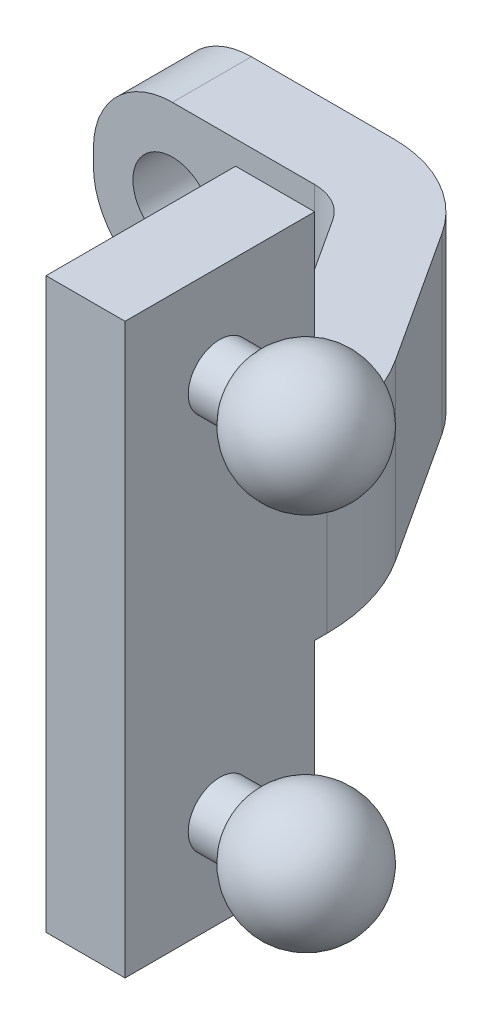
ISO-10303-21;
HEADER;
FILE_DESCRIPTION(('STEP AP214'),'2;1');
FILE_NAME('part.step','',(''),(''),'','','');
FILE_SCHEMA(('AUTOMOTIVE_DESIGN { 1 0 10303 214 1 1 1 1 }'));
ENDSEC;
DATA;
#1=APPLICATION_CONTEXT('core data for automotive mechanical design processes');
#2=APPLICATION_PROTOCOL_DEFINITION('international standard','automotive_design',2000,#1);
#3=PRODUCT_CONTEXT('',#1,'mechanical');
#4=PRODUCT('Part','Part','',(#3));
#5=PRODUCT_RELATED_PRODUCT_CATEGORY('part','',(#4));
#6=PRODUCT_DEFINITION_FORMATION('','',#4);
#7=PRODUCT_DEFINITION_CONTEXT('part definition',#1,'design');
#8=PRODUCT_DEFINITION('design','',#6,#7);
#9=PRODUCT_DEFINITION_SHAPE('','',#8);
#10=(LENGTH_UNIT() NAMED_UNIT(*) SI_UNIT(.MILLI.,.METRE.));
#11=(NAMED_UNIT(*) PLANE_ANGLE_UNIT() SI_UNIT($,.RADIAN.));
#12=(NAMED_UNIT(*) SI_UNIT($,.STERADIAN.) SOLID_ANGLE_UNIT());
#13=UNCERTAINTY_MEASURE_WITH_UNIT(LENGTH_MEASURE(1.E-05),#10,'distance_accuracy_value','');
#14=(GEOMETRIC_REPRESENTATION_CONTEXT(3) GLOBAL_UNCERTAINTY_ASSIGNED_CONTEXT((#13)) GLOBAL_UNIT_ASSIGNED_CONTEXT((#10,
#11,#12)) REPRESENTATION_CONTEXT('',''));
#15=CARTESIAN_POINT('',(0.,0.,0.));
#16=DIRECTION('',(0.,0.,1.));
#17=DIRECTION('',(1.,0.,0.));
#18=AXIS2_PLACEMENT_3D('',#15,#16,#17);
#19=CARTESIAN_POINT('',(0.,2.75,0.));
#20=DIRECTION('',(1.,0.,0.));
#21=DIRECTION('',(0.,0.,-1.));
#22=AXIS2_PLACEMENT_3D('',#19,#20,#21);
#23=PLANE('',#22);
#24=DIRECTION('',(0.,-1.,0.));
#25=VECTOR('',#24,1.);
#26=CARTESIAN_POINT('',(0.,2.75,0.));
#27=LINE('',#26,#25);
#28=CARTESIAN_POINT('',(0.,0.25,0.));
#29=VERTEX_POINT('',#28);
#30=CARTESIAN_POINT('',(0.,-0.25,0.));
#31=VERTEX_POINT('',#30);
#32=EDGE_CURVE('E245',#29,#31,#27,.T.);
#33=ORIENTED_EDGE('',*,*,#32,.T.);
#34=DIRECTION('',(0.,0.,1.));
#35=VECTOR('',#34,1.);
#36=CARTESIAN_POINT('',(0.,-0.25,2.5));
#37=LINE('',#36,#35);
#38=CARTESIAN_POINT('',(0.,-0.25,2.5));
#39=VERTEX_POINT('',#38);
#40=EDGE_CURVE('E296',#31,#39,#37,.T.);
#41=ORIENTED_EDGE('',*,*,#40,.T.);
#42=DIRECTION('',(0.,-1.,0.));
#43=VECTOR('',#42,1.);
#44=CARTESIAN_POINT('',(0.,2.75,2.5));
#45=LINE('',#44,#43);
#46=CARTESIAN_POINT('',(0.,0.25,2.5));
#47=VERTEX_POINT('',#46);
#48=EDGE_CURVE('E291',#47,#39,#45,.T.);
#49=ORIENTED_EDGE('',*,*,#48,.F.);
#50=DIRECTION('',(0.,0.,1.));
#51=VECTOR('',#50,1.);
#52=CARTESIAN_POINT('',(0.,0.25,0.));
#53=LINE('',#52,#51);
#54=EDGE_CURVE('E294',#47,#29,#53,.F.);
#55=ORIENTED_EDGE('',*,*,#54,.T.);
#56=EDGE_LOOP('',(#33,#41,#49,#55));
#57=FACE_BOUND('',#56,.T.);
#58=ADVANCED_FACE('F41',(#57),#23,.F.);
#59=CARTESIAN_POINT('',(0.,2.75,2.5));
#60=DIRECTION('',(0.,0.,-1.));
#61=DIRECTION('',(-1.,0.,0.));
#62=AXIS2_PLACEMENT_3D('',#59,#60,#61);
#63=PLANE('',#62);
#64=CARTESIAN_POINT('',(2.5,0.,2.5));
#65=DIRECTION('',(0.,0.,-1.));
#66=DIRECTION('',(-1.,0.,0.));
#67=AXIS2_PLACEMENT_3D('',#64,#65,#66);
#68=CIRCLE('',#67,1.25);
#69=CARTESIAN_POINT('',(1.25,0.,2.5));
#70=VERTEX_POINT('',#69);
#71=EDGE_CURVE('E220',#70,#70,#68,.T.);
#72=ORIENTED_EDGE('',*,*,#71,.T.);
#73=EDGE_LOOP('',(#72));
#74=FACE_BOUND('',#73,.T.);
#75=ORIENTED_EDGE('',*,*,#48,.T.);
#76=CARTESIAN_POINT('',(2.5,-0.25,2.5));
#77=DIRECTION('',(0.,0.,-1.));
#78=DIRECTION('',(-1.,0.,0.));
#79=AXIS2_PLACEMENT_3D('',#76,#77,#78);
#80=CIRCLE('',#79,2.5);
#81=CARTESIAN_POINT('',(2.5,-2.75,2.5));
#82=VERTEX_POINT('',#81);
#83=EDGE_CURVE('E301',#39,#82,#80,.F.);
#84=ORIENTED_EDGE('',*,*,#83,.T.);
#85=DIRECTION('',(1.,0.,0.));
#86=VECTOR('',#85,1.);
#87=CARTESIAN_POINT('',(0.,-2.75,2.5));
#88=LINE('',#87,#86);
#89=CARTESIAN_POINT('',(7.,-2.75,2.5));
#90=VERTEX_POINT('',#89);
#91=EDGE_CURVE('E223',#82,#90,#88,.T.);
#92=ORIENTED_EDGE('',*,*,#91,.T.);
#93=DIRECTION('',(0.,-1.,0.));
#94=VECTOR('',#93,1.);
#95=CARTESIAN_POINT('',(7.,2.75,2.5));
#96=LINE('',#95,#94);
#97=CARTESIAN_POINT('',(7.,2.75,2.5));
#98=VERTEX_POINT('',#97);
#99=EDGE_CURVE('E288',#98,#90,#96,.T.);
#100=ORIENTED_EDGE('',*,*,#99,.F.);
#101=DIRECTION('',(1.,0.,0.));
#102=VECTOR('',#101,1.);
#103=CARTESIAN_POINT('',(0.,2.75,2.5));
#104=LINE('',#103,#102);
#105=CARTESIAN_POINT('',(2.5,2.75,2.5));
#106=VERTEX_POINT('',#105);
#107=EDGE_CURVE('E224',#106,#98,#104,.T.);
#108=ORIENTED_EDGE('',*,*,#107,.F.);
#109=CARTESIAN_POINT('',(2.5,0.25,2.5));
#110=DIRECTION('',(0.,0.,-1.));
#111=DIRECTION('',(-1.,0.,0.));
#112=AXIS2_PLACEMENT_3D('',#109,#110,#111);
#113=CIRCLE('',#112,2.5);
#114=EDGE_CURVE('E299',#106,#47,#113,.F.);
#115=ORIENTED_EDGE('',*,*,#114,.T.);
#116=EDGE_LOOP('',(#75,#84,#92,#100,#108,#115));
#117=FACE_BOUND('',#116,.T.);
#118=ADVANCED_FACE('F384',(#74,#117),#63,.F.);
#119=CARTESIAN_POINT('',(7.,2.75,4.));
#120=DIRECTION('',(0.,-1.,0.));
#121=DIRECTION('',(0.,0.,-1.));
#122=AXIS2_PLACEMENT_3D('',#119,#120,#121);
#123=CYLINDRICAL_SURFACE('',#122,1.5);
#124=CARTESIAN_POINT('',(7.,-2.75,4.));
#125=DIRECTION('',(0.,-1.,0.));
#126=DIRECTION('',(0.,0.,-1.));
#127=AXIS2_PLACEMENT_3D('',#124,#125,#126);
#128=CIRCLE('',#127,1.5);
#129=CARTESIAN_POINT('',(8.25754577081105,-2.75,3.18233342106012));
#130=VERTEX_POINT('',#129);
#131=EDGE_CURVE('E247',#90,#130,#128,.T.);
#132=ORIENTED_EDGE('',*,*,#131,.T.);
#133=DIRECTION('',(0.,-1.,0.));
#134=VECTOR('',#133,1.);
#135=CARTESIAN_POINT('',(8.25754577081105,2.75,3.18233342106012));
#136=LINE('',#135,#134);
#137=CARTESIAN_POINT('',(8.25754577081105,2.75,3.18233342106012));
#138=VERTEX_POINT('',#137);
#139=EDGE_CURVE('E285',#138,#130,#136,.T.);
#140=ORIENTED_EDGE('',*,*,#139,.F.);
#141=CARTESIAN_POINT('',(7.,2.75,4.));
#142=DIRECTION('',(0.,-1.,0.));
#143=DIRECTION('',(0.,0.,-1.));
#144=AXIS2_PLACEMENT_3D('',#141,#142,#143);
#145=CIRCLE('',#144,1.5);
#146=EDGE_CURVE('E226',#98,#138,#145,.T.);
#147=ORIENTED_EDGE('',*,*,#146,.F.);
#148=ORIENTED_EDGE('',*,*,#99,.T.);
#149=EDGE_LOOP('',(#132,#140,#147,#148));
#150=FACE_BOUND('',#149,.T.);
#151=ADVANCED_FACE('F347',(#150),#123,.F.);
#152=CARTESIAN_POINT('',(8.25754577081105,2.75,3.18233342106012));
#153=DIRECTION('',(0.838363847207363,0.,-0.54511105262659));
#154=DIRECTION('',(-0.54511105262659,0.,-0.838363847207363));
#155=AXIS2_PLACEMENT_3D('',#152,#153,#154);
#156=PLANE('',#155);
#157=DIRECTION('',(0.54511105262659,0.,0.838363847207363));
#158=VECTOR('',#157,1.);
#159=CARTESIAN_POINT('',(8.25754577081105,-2.75,3.18233342106012));
#160=LINE('',#159,#158);
#161=CARTESIAN_POINT('',(10.9902966016318,-2.75,7.38521921643481));
#162=VERTEX_POINT('',#161);
#163=EDGE_CURVE('E249',#130,#162,#160,.T.);
#164=ORIENTED_EDGE('',*,*,#163,.T.);
#165=DIRECTION('',(0.,-1.,0.));
#166=VECTOR('',#165,1.);
#167=CARTESIAN_POINT('',(10.9902966016318,2.75,7.38521921643481));
#168=LINE('',#167,#166);
#169=CARTESIAN_POINT('',(10.9902966016318,2.75,7.38521921643481));
#170=VERTEX_POINT('',#169);
#171=EDGE_CURVE('E282',#170,#162,#168,.T.);
#172=ORIENTED_EDGE('',*,*,#171,.F.);
#173=DIRECTION('',(0.54511105262659,0.,0.838363847207363));
#174=VECTOR('',#173,1.);
#175=CARTESIAN_POINT('',(8.25754577081105,2.75,3.18233342106012));
#176=LINE('',#175,#174);
#177=EDGE_CURVE('E229',#138,#170,#176,.T.);
#178=ORIENTED_EDGE('',*,*,#177,.F.);
#179=ORIENTED_EDGE('',*,*,#139,.T.);
#180=EDGE_LOOP('',(#164,#172,#178,#179));
#181=FACE_BOUND('',#180,.T.);
#182=ADVANCED_FACE('F343',(#181),#156,.F.);
#183=CARTESIAN_POINT('',(8.34660028365028,2.75,9.10417225516659));
#184=DIRECTION('',(0.,-1.,0.));
#185=DIRECTION('',(0.,0.,-1.));
#186=AXIS2_PLACEMENT_3D('',#183,#184,#185);
#187=CYLINDRICAL_SURFACE('',#186,3.15339971634972);
#188=CARTESIAN_POINT('',(8.34660028365028,-2.75,9.10417225516659));
#189=DIRECTION('',(0.,-1.,0.));
#190=DIRECTION('',(0.,0.,1.));
#191=AXIS2_PLACEMENT_3D('',#188,#189,#190);
#192=CIRCLE('',#191,3.15339971634972);
#193=CARTESIAN_POINT('',(11.5,-2.75,9.10417225516659));
#194=VERTEX_POINT('',#193);
#195=EDGE_CURVE('E251',#162,#194,#192,.T.);
#196=ORIENTED_EDGE('',*,*,#195,.T.);
#197=DIRECTION('',(0.,-1.,0.));
#198=VECTOR('',#197,1.);
#199=CARTESIAN_POINT('',(11.5,2.75,9.10417225516659));
#200=LINE('',#199,#198);
#201=CARTESIAN_POINT('',(11.5,2.75,9.10417225516659));
#202=VERTEX_POINT('',#201);
#203=EDGE_CURVE('E179',#202,#194,#200,.T.);
#204=ORIENTED_EDGE('',*,*,#203,.F.);
#205=CARTESIAN_POINT('',(8.34660028365028,2.75,9.10417225516659));
#206=DIRECTION('',(0.,-1.,0.));
#207=DIRECTION('',(0.,0.,1.));
#208=AXIS2_PLACEMENT_3D('',#205,#206,#207);
#209=CIRCLE('',#208,3.15339971634972);
#210=EDGE_CURVE('E231',#170,#202,#209,.T.);
#211=ORIENTED_EDGE('',*,*,#210,.F.);
#212=ORIENTED_EDGE('',*,*,#171,.T.);
#213=EDGE_LOOP('',(#196,#204,#211,#212));
#214=FACE_BOUND('',#213,.T.);
#215=ADVANCED_FACE('F339',(#214),#187,.F.);
#216=CARTESIAN_POINT('',(11.5,2.75,9.10417225516659));
#217=DIRECTION('',(1.,0.,0.));
#218=DIRECTION('',(0.,0.,-1.));
#219=AXIS2_PLACEMENT_3D('',#216,#217,#218);
#220=PLANE('',#219);
#221=DIRECTION('',(0.,0.,1.));
#222=VECTOR('',#221,1.);
#223=CARTESIAN_POINT('',(11.5,-2.75,9.10417225516659));
#224=LINE('',#223,#222);
#225=CARTESIAN_POINT('',(11.5,-2.75,9.5));
#226=VERTEX_POINT('',#225);
#227=EDGE_CURVE('E253',#194,#226,#224,.T.);
#228=ORIENTED_EDGE('',*,*,#227,.T.);
#229=DIRECTION('',(0.,-1.,0.));
#230=VECTOR('',#229,1.);
#231=CARTESIAN_POINT('',(11.5,8.99999999999999,9.5));
#232=LINE('',#231,#230);
#233=CARTESIAN_POINT('',(11.5,-9.,9.5));
#234=VERTEX_POINT('',#233);
#235=EDGE_CURVE('E193',#226,#234,#232,.T.);
#236=ORIENTED_EDGE('',*,*,#235,.T.);
#237=DIRECTION('',(0.,0.,1.));
#238=VECTOR('',#237,1.);
#239=CARTESIAN_POINT('',(11.5,-9.,9.5));
#240=LINE('',#239,#238);
#241=CARTESIAN_POINT('',(11.5,-9.,15.5));
#242=VERTEX_POINT('',#241);
#243=EDGE_CURVE('E175',#234,#242,#240,.T.);
#244=ORIENTED_EDGE('',*,*,#243,.T.);
#245=DIRECTION('',(0.,-1.,0.));
#246=VECTOR('',#245,1.);
#247=CARTESIAN_POINT('',(11.5,2.75,15.5));
#248=LINE('',#247,#246);
#249=CARTESIAN_POINT('',(11.5,9.,15.5));
#250=VERTEX_POINT('',#249);
#251=EDGE_CURVE('E167',#250,#242,#248,.T.);
#252=ORIENTED_EDGE('',*,*,#251,.F.);
#253=DIRECTION('',(0.,0.,-1.));
#254=VECTOR('',#253,1.);
#255=CARTESIAN_POINT('',(11.5,8.99999999999999,9.5));
#256=LINE('',#255,#254);
#257=CARTESIAN_POINT('',(11.5,8.99999999999999,9.5));
#258=VERTEX_POINT('',#257);
#259=EDGE_CURVE('E173',#250,#258,#256,.T.);
#260=ORIENTED_EDGE('',*,*,#259,.T.);
#261=CARTESIAN_POINT('',(11.5,2.75,9.5));
#262=VERTEX_POINT('',#261);
#263=EDGE_CURVE('E196',#258,#262,#232,.T.);
#264=ORIENTED_EDGE('',*,*,#263,.T.);
#265=DIRECTION('',(0.,0.,1.));
#266=VECTOR('',#265,1.);
#267=CARTESIAN_POINT('',(11.5,2.75,9.10417225516659));
#268=LINE('',#267,#266);
#269=EDGE_CURVE('E56',#202,#262,#268,.T.);
#270=ORIENTED_EDGE('',*,*,#269,.F.);
#271=ORIENTED_EDGE('',*,*,#203,.T.);
#272=EDGE_LOOP('',(#228,#236,#244,#252,#260,#264,#270,#271));
#273=FACE_BOUND('',#272,.T.);
#274=ADVANCED_FACE('F170',(#273),#220,.F.);
#275=CARTESIAN_POINT('',(11.5,2.75,15.5));
#276=DIRECTION('',(0.,0.,-1.));
#277=DIRECTION('',(-1.,0.,0.));
#278=AXIS2_PLACEMENT_3D('',#275,#276,#277);
#279=PLANE('',#278);
#280=ORIENTED_EDGE('',*,*,#251,.T.);
#281=DIRECTION('',(-1.,0.,0.));
#282=VECTOR('',#281,1.);
#283=CARTESIAN_POINT('',(32.9736659610103,-9.,15.5));
#284=LINE('',#283,#282);
#285=CARTESIAN_POINT('',(14.,-9.,15.5));
#286=VERTEX_POINT('',#285);
#287=EDGE_CURVE('E206',#286,#242,#284,.T.);
#288=ORIENTED_EDGE('',*,*,#287,.F.);
#289=DIRECTION('',(0.,-1.,0.));
#290=VECTOR('',#289,1.);
#291=CARTESIAN_POINT('',(14.,2.75,15.5));
#292=LINE('',#291,#290);
#293=CARTESIAN_POINT('',(14.,9.,15.5));
#294=VERTEX_POINT('',#293);
#295=EDGE_CURVE('E180',#294,#286,#292,.T.);
#296=ORIENTED_EDGE('',*,*,#295,.F.);
#297=DIRECTION('',(-1.,0.,0.));
#298=VECTOR('',#297,1.);
#299=CARTESIAN_POINT('',(32.9736659610103,9.,15.5));
#300=LINE('',#299,#298);
#301=EDGE_CURVE('E183',#294,#250,#300,.T.);
#302=ORIENTED_EDGE('',*,*,#301,.T.);
#303=EDGE_LOOP('',(#280,#288,#296,#302));
#304=FACE_BOUND('',#303,.T.);
#305=ADVANCED_FACE('F184',(#304),#279,.F.);
#306=CARTESIAN_POINT('',(14.,2.75,9.10417225516659));
#307=DIRECTION('',(-1.,0.,0.));
#308=DIRECTION('',(0.,0.,1.));
#309=AXIS2_PLACEMENT_3D('',#306,#307,#308);
#310=PLANE('',#309);
#311=CARTESIAN_POINT('',(14.,-5.99999999999999,12.5));
#312=DIRECTION('',(-1.,0.,0.));
#313=DIRECTION('',(0.,0.,-1.));
#314=AXIS2_PLACEMENT_3D('',#311,#312,#313);
#315=CIRCLE('',#314,1.);
#316=CARTESIAN_POINT('',(14.,-5.99999999999999,11.5));
#317=VERTEX_POINT('',#316);
#318=EDGE_CURVE('E199',#317,#317,#315,.T.);
#319=ORIENTED_EDGE('',*,*,#318,.T.);
#320=EDGE_LOOP('',(#319));
#321=FACE_BOUND('',#320,.T.);
#322=CARTESIAN_POINT('',(14.,5.99999999999999,12.5));
#323=DIRECTION('',(-1.,0.,0.));
#324=DIRECTION('',(0.,0.,1.));
#325=AXIS2_PLACEMENT_3D('',#322,#323,#324);
#326=CIRCLE('',#325,1.);
#327=CARTESIAN_POINT('',(14.,5.99999999999999,13.5));
#328=VERTEX_POINT('',#327);
#329=EDGE_CURVE('E11',#328,#328,#326,.F.);
#330=ORIENTED_EDGE('',*,*,#329,.F.);
#331=EDGE_LOOP('',(#330));
#332=FACE_BOUND('',#331,.T.);
#333=DIRECTION('',(0.,0.,-1.));
#334=VECTOR('',#333,1.);
#335=CARTESIAN_POINT('',(14.,2.75,9.10417225516659));
#336=LINE('',#335,#334);
#337=CARTESIAN_POINT('',(14.,2.75,9.5));
#338=VERTEX_POINT('',#337);
#339=CARTESIAN_POINT('',(14.,2.75,9.10417225516659));
#340=VERTEX_POINT('',#339);
#341=EDGE_CURVE('E234',#338,#340,#336,.T.);
#342=ORIENTED_EDGE('',*,*,#341,.F.);
#343=DIRECTION('',(0.,1.,0.));
#344=VECTOR('',#343,1.);
#345=CARTESIAN_POINT('',(14.,8.99999999999999,9.5));
#346=LINE('',#345,#344);
#347=CARTESIAN_POINT('',(14.,8.99999999999999,9.5));
#348=VERTEX_POINT('',#347);
#349=EDGE_CURVE('E208',#338,#348,#346,.T.);
#350=ORIENTED_EDGE('',*,*,#349,.T.);
#351=DIRECTION('',(0.,0.,1.));
#352=VECTOR('',#351,1.);
#353=CARTESIAN_POINT('',(14.,8.99999999999999,9.49999999999999));
#354=LINE('',#353,#352);
#355=EDGE_CURVE('E213',#348,#294,#354,.T.);
#356=ORIENTED_EDGE('',*,*,#355,.T.);
#357=ORIENTED_EDGE('',*,*,#295,.T.);
#358=DIRECTION('',(0.,0.,-1.));
#359=VECTOR('',#358,1.);
#360=CARTESIAN_POINT('',(14.,-9.,9.49999999999999));
#361=LINE('',#360,#359);
#362=CARTESIAN_POINT('',(14.,-9.,9.5));
#363=VERTEX_POINT('',#362);
#364=EDGE_CURVE('E202',#286,#363,#361,.T.);
#365=ORIENTED_EDGE('',*,*,#364,.T.);
#366=CARTESIAN_POINT('',(14.,-2.75,9.49999999999999));
#367=VERTEX_POINT('',#366);
#368=EDGE_CURVE('E64',#363,#367,#346,.T.);
#369=ORIENTED_EDGE('',*,*,#368,.T.);
#370=DIRECTION('',(0.,0.,-1.));
#371=VECTOR('',#370,1.);
#372=CARTESIAN_POINT('',(14.,-2.75,9.10417225516659));
#373=LINE('',#372,#371);
#374=CARTESIAN_POINT('',(14.,-2.75,9.10417225516659));
#375=VERTEX_POINT('',#374);
#376=EDGE_CURVE('E255',#367,#375,#373,.T.);
#377=ORIENTED_EDGE('',*,*,#376,.T.);
#378=DIRECTION('',(0.,-1.,0.));
#379=VECTOR('',#378,1.);
#380=CARTESIAN_POINT('',(14.,2.75,9.10417225516659));
#381=LINE('',#380,#379);
#382=EDGE_CURVE('E276',#340,#375,#381,.T.);
#383=ORIENTED_EDGE('',*,*,#382,.F.);
#384=EDGE_LOOP('',(#342,#350,#356,#357,#365,#369,#377,#383));
#385=FACE_BOUND('',#384,.T.);
#386=ADVANCED_FACE('F322',(#321,#332,#385),#310,.F.);
#387=CARTESIAN_POINT('',(8.34660028365028,2.75,9.10417225516659));
#388=DIRECTION('',(0.,-1.,0.));
#389=DIRECTION('',(0.,0.,-1.));
#390=AXIS2_PLACEMENT_3D('',#387,#388,#389);
#391=CYLINDRICAL_SURFACE('',#390,5.65339971634972);
#392=CARTESIAN_POINT('',(8.34660028365028,-2.75,9.10417225516659));
#393=DIRECTION('',(0.,1.,0.));
#394=DIRECTION('',(0.,0.,-1.));
#395=AXIS2_PLACEMENT_3D('',#392,#393,#394);
#396=CIRCLE('',#395,5.65339971634972);
#397=CARTESIAN_POINT('',(13.0862062196502,-2.75,6.02244158486833));
#398=VERTEX_POINT('',#397);
#399=EDGE_CURVE('E257',#375,#398,#396,.T.);
#400=ORIENTED_EDGE('',*,*,#399,.T.);
#401=DIRECTION('',(0.,-1.,0.));
#402=VECTOR('',#401,1.);
#403=CARTESIAN_POINT('',(13.0862062196502,2.75,6.02244158486833));
#404=LINE('',#403,#402);
#405=CARTESIAN_POINT('',(13.0862062196502,2.75,6.02244158486833));
#406=VERTEX_POINT('',#405);
#407=EDGE_CURVE('E273',#406,#398,#404,.T.);
#408=ORIENTED_EDGE('',*,*,#407,.F.);
#409=CARTESIAN_POINT('',(8.34660028365028,2.75,9.10417225516659));
#410=DIRECTION('',(0.,1.,0.));
#411=DIRECTION('',(0.,0.,-1.));
#412=AXIS2_PLACEMENT_3D('',#409,#410,#411);
#413=CIRCLE('',#412,5.65339971634972);
#414=EDGE_CURVE('E236',#340,#406,#413,.T.);
#415=ORIENTED_EDGE('',*,*,#414,.F.);
#416=ORIENTED_EDGE('',*,*,#382,.T.);
#417=EDGE_LOOP('',(#400,#408,#415,#416));
#418=FACE_BOUND('',#417,.T.);
#419=ADVANCED_FACE('F325',(#418),#391,.T.);
#420=CARTESIAN_POINT('',(10.3534553888295,2.75,1.81955578949364));
#421=DIRECTION('',(-0.838363847207363,0.,0.54511105262659));
#422=DIRECTION('',(0.54511105262659,0.,0.838363847207363));
#423=AXIS2_PLACEMENT_3D('',#420,#421,#422);
#424=PLANE('',#423);
#425=DIRECTION('',(-0.54511105262659,0.,-0.838363847207363));
#426=VECTOR('',#425,1.);
#427=CARTESIAN_POINT('',(10.3534553888295,-2.75,1.81955578949364));
#428=LINE('',#427,#426);
#429=CARTESIAN_POINT('',(10.3534553888295,-2.75,1.81955578949364));
#430=VERTEX_POINT('',#429);
#431=EDGE_CURVE('E259',#398,#430,#428,.T.);
#432=ORIENTED_EDGE('',*,*,#431,.T.);
#433=DIRECTION('',(0.,-1.,0.));
#434=VECTOR('',#433,1.);
#435=CARTESIAN_POINT('',(10.3534553888295,2.75,1.81955578949364));
#436=LINE('',#435,#434);
#437=CARTESIAN_POINT('',(10.3534553888295,2.75,1.81955578949364));
#438=VERTEX_POINT('',#437);
#439=EDGE_CURVE('E270',#438,#430,#436,.T.);
#440=ORIENTED_EDGE('',*,*,#439,.F.);
#441=DIRECTION('',(-0.54511105262659,0.,-0.838363847207363));
#442=VECTOR('',#441,1.);
#443=CARTESIAN_POINT('',(10.3534553888295,2.75,1.81955578949364));
#444=LINE('',#443,#442);
#445=EDGE_CURVE('E238',#406,#438,#444,.T.);
#446=ORIENTED_EDGE('',*,*,#445,.F.);
#447=ORIENTED_EDGE('',*,*,#407,.T.);
#448=EDGE_LOOP('',(#432,#440,#446,#447));
#449=FACE_BOUND('',#448,.T.);
#450=ADVANCED_FACE('F374',(#449),#424,.F.);
#451=CARTESIAN_POINT('',(7.,2.75,4.));
#452=DIRECTION('',(0.,-1.,0.));
#453=DIRECTION('',(0.,0.,-1.));
#454=AXIS2_PLACEMENT_3D('',#451,#452,#453);
#455=CYLINDRICAL_SURFACE('',#454,4.);
#456=CARTESIAN_POINT('',(7.,-2.75,4.));
#457=DIRECTION('',(0.,1.,0.));
#458=DIRECTION('',(0.,0.,-1.));
#459=AXIS2_PLACEMENT_3D('',#456,#457,#458);
#460=CIRCLE('',#459,4.);
#461=CARTESIAN_POINT('',(7.,-2.75,0.));
#462=VERTEX_POINT('',#461);
#463=EDGE_CURVE('E261',#430,#462,#460,.T.);
#464=ORIENTED_EDGE('',*,*,#463,.T.);
#465=DIRECTION('',(0.,-1.,0.));
#466=VECTOR('',#465,1.);
#467=CARTESIAN_POINT('',(7.,2.75,0.));
#468=LINE('',#467,#466);
#469=CARTESIAN_POINT('',(7.,2.75,0.));
#470=VERTEX_POINT('',#469);
#471=EDGE_CURVE('E267',#470,#462,#468,.T.);
#472=ORIENTED_EDGE('',*,*,#471,.F.);
#473=CARTESIAN_POINT('',(7.,2.75,4.));
#474=DIRECTION('',(0.,1.,0.));
#475=DIRECTION('',(0.,0.,-1.));
#476=AXIS2_PLACEMENT_3D('',#473,#474,#475);
#477=CIRCLE('',#476,4.);
#478=EDGE_CURVE('E240',#438,#470,#477,.T.);
#479=ORIENTED_EDGE('',*,*,#478,.F.);
#480=ORIENTED_EDGE('',*,*,#439,.T.);
#481=EDGE_LOOP('',(#464,#472,#479,#480));
#482=FACE_BOUND('',#481,.T.);
#483=ADVANCED_FACE('F371',(#482),#455,.T.);
#484=CARTESIAN_POINT('',(0.,2.75,0.));
#485=DIRECTION('',(0.,0.,1.));
#486=DIRECTION('',(1.,0.,0.));
#487=AXIS2_PLACEMENT_3D('',#484,#485,#486);
#488=PLANE('',#487);
#489=CARTESIAN_POINT('',(2.5,0.,0.));
#490=DIRECTION('',(0.,0.,-1.));
#491=DIRECTION('',(-1.,0.,0.));
#492=AXIS2_PLACEMENT_3D('',#489,#490,#491);
#493=CIRCLE('',#492,1.25);
#494=CARTESIAN_POINT('',(1.25,0.,0.));
#495=VERTEX_POINT('',#494);
#496=EDGE_CURVE('E217',#495,#495,#493,.T.);
#497=ORIENTED_EDGE('',*,*,#496,.F.);
#498=EDGE_LOOP('',(#497));
#499=FACE_BOUND('',#498,.T.);
#500=DIRECTION('',(-1.,0.,0.));
#501=VECTOR('',#500,1.);
#502=CARTESIAN_POINT('',(0.,-2.75,0.));
#503=LINE('',#502,#501);
#504=CARTESIAN_POINT('',(2.5,-2.75,0.));
#505=VERTEX_POINT('',#504);
#506=EDGE_CURVE('E227',#462,#505,#503,.T.);
#507=ORIENTED_EDGE('',*,*,#506,.T.);
#508=CARTESIAN_POINT('',(2.5,-0.25,0.));
#509=DIRECTION('',(0.,0.,1.));
#510=DIRECTION('',(1.,0.,0.));
#511=AXIS2_PLACEMENT_3D('',#508,#509,#510);
#512=CIRCLE('',#511,2.5);
#513=EDGE_CURVE('E307',#505,#31,#512,.F.);
#514=ORIENTED_EDGE('',*,*,#513,.T.);
#515=ORIENTED_EDGE('',*,*,#32,.F.);
#516=CARTESIAN_POINT('',(2.5,0.25,0.));
#517=DIRECTION('',(0.,0.,1.));
#518=DIRECTION('',(1.,0.,0.));
#519=AXIS2_PLACEMENT_3D('',#516,#517,#518);
#520=CIRCLE('',#519,2.5);
#521=CARTESIAN_POINT('',(2.5,2.75,0.));
#522=VERTEX_POINT('',#521);
#523=EDGE_CURVE('E305',#29,#522,#520,.F.);
#524=ORIENTED_EDGE('',*,*,#523,.T.);
#525=DIRECTION('',(-1.,0.,0.));
#526=VECTOR('',#525,1.);
#527=CARTESIAN_POINT('',(0.,2.75,0.));
#528=LINE('',#527,#526);
#529=EDGE_CURVE('E242',#470,#522,#528,.T.);
#530=ORIENTED_EDGE('',*,*,#529,.F.);
#531=ORIENTED_EDGE('',*,*,#471,.T.);
#532=EDGE_LOOP('',(#507,#514,#515,#524,#530,#531));
#533=FACE_BOUND('',#532,.T.);
#534=ADVANCED_FACE('F359',(#499,#533),#488,.F.);
#535=CARTESIAN_POINT('',(7.,2.75,4.));
#536=DIRECTION('',(0.,-1.,0.));
#537=DIRECTION('',(0.,0.,-1.));
#538=AXIS2_PLACEMENT_3D('',#535,#536,#537);
#539=PLANE('',#538);
#540=ORIENTED_EDGE('',*,*,#269,.T.);
#541=DIRECTION('',(1.,0.,0.));
#542=VECTOR('',#541,1.);
#543=CARTESIAN_POINT('',(7.,2.75,9.5));
#544=LINE('',#543,#542);
#545=EDGE_CURVE('E215',#262,#338,#544,.T.);
#546=ORIENTED_EDGE('',*,*,#545,.T.);
#547=ORIENTED_EDGE('',*,*,#341,.T.);
#548=ORIENTED_EDGE('',*,*,#414,.T.);
#549=ORIENTED_EDGE('',*,*,#445,.T.);
#550=ORIENTED_EDGE('',*,*,#478,.T.);
#551=ORIENTED_EDGE('',*,*,#529,.T.);
#552=DIRECTION('',(0.,0.,1.));
#553=VECTOR('',#552,1.);
#554=CARTESIAN_POINT('',(2.5,2.75,4.));
#555=LINE('',#554,#553);
#556=EDGE_CURVE('E309',#522,#106,#555,.T.);
#557=ORIENTED_EDGE('',*,*,#556,.T.);
#558=ORIENTED_EDGE('',*,*,#107,.T.);
#559=ORIENTED_EDGE('',*,*,#146,.T.);
#560=ORIENTED_EDGE('',*,*,#177,.T.);
#561=ORIENTED_EDGE('',*,*,#210,.T.);
#562=EDGE_LOOP('',(#540,#546,#547,#548,#549,#550,#551,#557,#558,#559,#560,#561));
#563=FACE_BOUND('',#562,.T.);
#564=ADVANCED_FACE('F328',(#563),#539,.F.);
#565=CARTESIAN_POINT('',(7.,-2.75,4.));
#566=DIRECTION('',(0.,-1.,0.));
#567=DIRECTION('',(0.,0.,-1.));
#568=AXIS2_PLACEMENT_3D('',#565,#566,#567);
#569=PLANE('',#568);
#570=DIRECTION('',(1.,0.,0.));
#571=VECTOR('',#570,1.);
#572=CARTESIAN_POINT('',(7.,-2.75,9.50000000000001));
#573=LINE('',#572,#571);
#574=EDGE_CURVE('E49',#226,#367,#573,.T.);
#575=ORIENTED_EDGE('',*,*,#574,.F.);
#576=ORIENTED_EDGE('',*,*,#227,.F.);
#577=ORIENTED_EDGE('',*,*,#195,.F.);
#578=ORIENTED_EDGE('',*,*,#163,.F.);
#579=ORIENTED_EDGE('',*,*,#131,.F.);
#580=ORIENTED_EDGE('',*,*,#91,.F.);
#581=DIRECTION('',(0.,0.,1.));
#582=VECTOR('',#581,1.);
#583=CARTESIAN_POINT('',(2.5,-2.75,0.));
#584=LINE('',#583,#582);
#585=EDGE_CURVE('E303',#82,#505,#584,.F.);
#586=ORIENTED_EDGE('',*,*,#585,.T.);
#587=ORIENTED_EDGE('',*,*,#506,.F.);
#588=ORIENTED_EDGE('',*,*,#463,.F.);
#589=ORIENTED_EDGE('',*,*,#431,.F.);
#590=ORIENTED_EDGE('',*,*,#399,.F.);
#591=ORIENTED_EDGE('',*,*,#376,.F.);
#592=EDGE_LOOP('',(#575,#576,#577,#578,#579,#580,#586,#587,#588,#589,#590,#591));
#593=FACE_BOUND('',#592,.T.);
#594=ADVANCED_FACE('F319',(#593),#569,.T.);
#595=CARTESIAN_POINT('',(2.5,0.,10.));
#596=DIRECTION('',(0.,0.,-1.));
#597=DIRECTION('',(-1.,0.,0.));
#598=AXIS2_PLACEMENT_3D('',#595,#596,#597);
#599=CYLINDRICAL_SURFACE('',#598,1.25);
#600=ORIENTED_EDGE('',*,*,#496,.T.);
#601=EDGE_LOOP('',(#600));
#602=FACE_BOUND('',#601,.T.);
#603=ORIENTED_EDGE('',*,*,#71,.F.);
#604=EDGE_LOOP('',(#603));
#605=FACE_BOUND('',#604,.T.);
#606=ADVANCED_FACE('F394',(#602,#605),#599,.F.);
#607=CARTESIAN_POINT('',(2.5,-0.25,0.));
#608=DIRECTION('',(0.,0.,-1.));
#609=DIRECTION('',(-1.,0.,0.));
#610=AXIS2_PLACEMENT_3D('',#607,#608,#609);
#611=CYLINDRICAL_SURFACE('',#610,2.5);
#612=ORIENTED_EDGE('',*,*,#513,.F.);
#613=ORIENTED_EDGE('',*,*,#585,.F.);
#614=ORIENTED_EDGE('',*,*,#83,.F.);
#615=ORIENTED_EDGE('',*,*,#40,.F.);
#616=EDGE_LOOP('',(#612,#613,#614,#615));
#617=FACE_BOUND('',#616,.T.);
#618=ADVANCED_FACE('F355',(#617),#611,.T.);
#619=CARTESIAN_POINT('',(2.5,0.25,4.));
#620=DIRECTION('',(0.,0.,1.));
#621=DIRECTION('',(1.,0.,0.));
#622=AXIS2_PLACEMENT_3D('',#619,#620,#621);
#623=CYLINDRICAL_SURFACE('',#622,2.5);
#624=ORIENTED_EDGE('',*,*,#523,.F.);
#625=ORIENTED_EDGE('',*,*,#54,.F.);
#626=ORIENTED_EDGE('',*,*,#114,.F.);
#627=ORIENTED_EDGE('',*,*,#556,.F.);
#628=EDGE_LOOP('',(#624,#625,#626,#627));
#629=FACE_BOUND('',#628,.T.);
#630=ADVANCED_FACE('F43',(#629),#623,.T.);
#631=CARTESIAN_POINT('',(32.9736659610103,-9.,9.49999999999999));
#632=DIRECTION('',(0.,-1.,0.));
#633=DIRECTION('',(0.,0.,-1.));
#634=AXIS2_PLACEMENT_3D('',#631,#632,#633);
#635=PLANE('',#634);
#636=ORIENTED_EDGE('',*,*,#364,.F.);
#637=ORIENTED_EDGE('',*,*,#287,.T.);
#638=ORIENTED_EDGE('',*,*,#243,.F.);
#639=DIRECTION('',(-1.,0.,0.));
#640=VECTOR('',#639,1.);
#641=CARTESIAN_POINT('',(32.9736659610103,-9.,9.49999999999999));
#642=LINE('',#641,#640);
#643=EDGE_CURVE('E209',#363,#234,#642,.T.);
#644=ORIENTED_EDGE('',*,*,#643,.F.);
#645=EDGE_LOOP('',(#636,#637,#638,#644));
#646=FACE_BOUND('',#645,.T.);
#647=ADVANCED_FACE('F399',(#646),#635,.T.);
#648=CARTESIAN_POINT('',(32.9736659610103,8.99999999999999,9.49999999999999));
#649=DIRECTION('',(0.,0.,-1.));
#650=DIRECTION('',(-1.,0.,0.));
#651=AXIS2_PLACEMENT_3D('',#648,#649,#650);
#652=PLANE('',#651);
#653=ORIENTED_EDGE('',*,*,#235,.F.);
#654=ORIENTED_EDGE('',*,*,#574,.T.);
#655=ORIENTED_EDGE('',*,*,#368,.F.);
#656=ORIENTED_EDGE('',*,*,#643,.T.);
#657=EDGE_LOOP('',(#653,#654,#655,#656));
#658=FACE_BOUND('',#657,.T.);
#659=ADVANCED_FACE('F314',(#658),#652,.T.);
#660=ORIENTED_EDGE('',*,*,#545,.F.);
#661=ORIENTED_EDGE('',*,*,#263,.F.);
#662=DIRECTION('',(-1.,0.,0.));
#663=VECTOR('',#662,1.);
#664=CARTESIAN_POINT('',(32.9736659610103,8.99999999999999,9.49999999999999));
#665=LINE('',#664,#663);
#666=EDGE_CURVE('E188',#348,#258,#665,.T.);
#667=ORIENTED_EDGE('',*,*,#666,.F.);
#668=ORIENTED_EDGE('',*,*,#349,.F.);
#669=EDGE_LOOP('',(#660,#661,#667,#668));
#670=FACE_BOUND('',#669,.T.);
#671=ADVANCED_FACE('F332',(#670),#652,.T.);
#672=CARTESIAN_POINT('',(32.9736659610103,8.99999999999999,9.49999999999999));
#673=DIRECTION('',(0.,1.,0.));
#674=DIRECTION('',(0.,0.,1.));
#675=AXIS2_PLACEMENT_3D('',#672,#673,#674);
#676=PLANE('',#675);
#677=ORIENTED_EDGE('',*,*,#355,.F.);
#678=ORIENTED_EDGE('',*,*,#666,.T.);
#679=ORIENTED_EDGE('',*,*,#259,.F.);
#680=ORIENTED_EDGE('',*,*,#301,.F.);
#681=EDGE_LOOP('',(#677,#678,#679,#680));
#682=FACE_BOUND('',#681,.T.);
#683=ADVANCED_FACE('F190',(#682),#676,.T.);
#684=CARTESIAN_POINT('',(15.,5.99999999999999,12.5));
#685=DIRECTION('',(-1.,0.,0.));
#686=DIRECTION('',(0.,0.,1.));
#687=AXIS2_PLACEMENT_3D('',#684,#685,#686);
#688=CYLINDRICAL_SURFACE('',#687,1.);
#689=CARTESIAN_POINT('',(15.,5.99999999999999,12.5));
#690=DIRECTION('',(1.,0.,0.));
#691=DIRECTION('',(0.,0.,-1.));
#692=AXIS2_PLACEMENT_3D('',#689,#690,#691);
#693=CIRCLE('',#692,1.);
#694=CARTESIAN_POINT('',(15.,5.99999999999999,11.5));
#695=VERTEX_POINT('',#694);
#696=EDGE_CURVE('E194',#695,#695,#693,.T.);
#697=ORIENTED_EDGE('',*,*,#696,.F.);
#698=EDGE_LOOP('',(#697));
#699=FACE_BOUND('',#698,.T.);
#700=ORIENTED_EDGE('',*,*,#329,.T.);
#701=EDGE_LOOP('',(#700));
#702=FACE_BOUND('',#701,.T.);
#703=ADVANCED_FACE('F547',(#699,#702),#688,.T.);
#704=CARTESIAN_POINT('',(16.7320508075689,5.99999999999999,12.5));
#705=DIRECTION('',(-1.,0.,0.));
#706=DIRECTION('',(0.,1.,0.));
#707=AXIS2_PLACEMENT_3D('',#704,#705,#706);
#708=SPHERICAL_SURFACE('',#707,2.);
#709=ORIENTED_EDGE('',*,*,#696,.T.);
#710=EDGE_LOOP('',(#709));
#711=FACE_BOUND('',#710,.T.);
#712=ADVANCED_FACE('F554',(#711),#708,.T.);
#713=CARTESIAN_POINT('',(15.,-5.99999999999999,12.5));
#714=DIRECTION('',(-1.,0.,0.));
#715=DIRECTION('',(0.,0.,1.));
#716=AXIS2_PLACEMENT_3D('',#713,#714,#715);
#717=CYLINDRICAL_SURFACE('',#716,1.);
#718=CARTESIAN_POINT('',(15.,-5.99999999999999,12.5));
#719=DIRECTION('',(1.,0.,0.));
#720=DIRECTION('',(0.,0.,1.));
#721=AXIS2_PLACEMENT_3D('',#718,#719,#720);
#722=CIRCLE('',#721,1.);
#723=CARTESIAN_POINT('',(15.,-5.99999999999999,13.5));
#724=VERTEX_POINT('',#723);
#725=EDGE_CURVE('E600',#724,#724,#722,.T.);
#726=ORIENTED_EDGE('',*,*,#725,.F.);
#727=EDGE_LOOP('',(#726));
#728=FACE_BOUND('',#727,.T.);
#729=ORIENTED_EDGE('',*,*,#318,.F.);
#730=EDGE_LOOP('',(#729));
#731=FACE_BOUND('',#730,.T.);
#732=ADVANCED_FACE('F563',(#728,#731),#717,.T.);
#733=CARTESIAN_POINT('',(16.7320508075689,-5.99999999999999,12.5));
#734=DIRECTION('',(-1.,0.,0.));
#735=DIRECTION('',(0.,-1.,0.));
#736=AXIS2_PLACEMENT_3D('',#733,#734,#735);
#737=SPHERICAL_SURFACE('',#736,2.);
#738=ORIENTED_EDGE('',*,*,#725,.T.);
#739=EDGE_LOOP('',(#738));
#740=FACE_BOUND('',#739,.T.);
#741=ADVANCED_FACE('F572',(#740),#737,.T.);
#742=CLOSED_SHELL('',(#58,#118,#151,#182,#215,#274,#305,#386,#419,#450,#483,#534,#564,#594,#606,
#618,#630,#647,#659,#671,#683,#703,#712,#732,#741));
#743=MANIFOLD_SOLID_BREP('B2',#742);
#744=ADVANCED_BREP_SHAPE_REPRESENTATION('',(#18,#743),#14);
#745=SHAPE_DEFINITION_REPRESENTATION(#9,#744);
ENDSEC;
END-ISO-10303-21;
